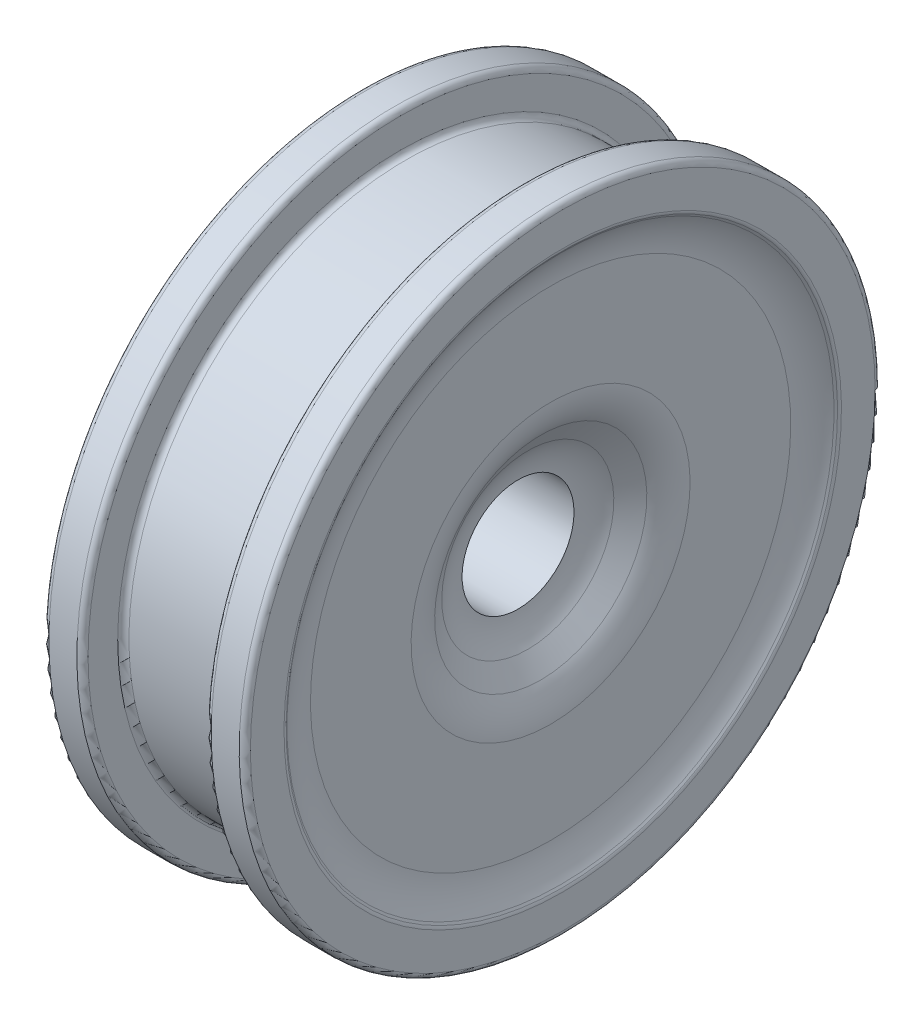
ISO-10303-21;
HEADER;
FILE_DESCRIPTION(('STEP AP214'),'2;1');
FILE_NAME('part.step','',(''),(''),'','','');
FILE_SCHEMA(('AUTOMOTIVE_DESIGN { 1 0 10303 214 1 1 1 1 }'));
ENDSEC;
DATA;
#1=APPLICATION_CONTEXT('core data for automotive mechanical design processes');
#2=APPLICATION_PROTOCOL_DEFINITION('international standard','automotive_design',2000,#1);
#3=PRODUCT_CONTEXT('',#1,'mechanical');
#4=PRODUCT('Part','Part','',(#3));
#5=PRODUCT_RELATED_PRODUCT_CATEGORY('part','',(#4));
#6=PRODUCT_DEFINITION_FORMATION('','',#4);
#7=PRODUCT_DEFINITION_CONTEXT('part definition',#1,'design');
#8=PRODUCT_DEFINITION('design','',#6,#7);
#9=PRODUCT_DEFINITION_SHAPE('','',#8);
#10=(LENGTH_UNIT() NAMED_UNIT(*) SI_UNIT(.MILLI.,.METRE.));
#11=(NAMED_UNIT(*) PLANE_ANGLE_UNIT() SI_UNIT($,.RADIAN.));
#12=(NAMED_UNIT(*) SI_UNIT($,.STERADIAN.) SOLID_ANGLE_UNIT());
#13=UNCERTAINTY_MEASURE_WITH_UNIT(LENGTH_MEASURE(1.E-05),#10,'distance_accuracy_value','');
#14=(GEOMETRIC_REPRESENTATION_CONTEXT(3) GLOBAL_UNCERTAINTY_ASSIGNED_CONTEXT((#13)) GLOBAL_UNIT_ASSIGNED_CONTEXT((#10,
#11,#12)) REPRESENTATION_CONTEXT('',''));
#15=CARTESIAN_POINT('',(0.,0.,0.));
#16=DIRECTION('',(0.,0.,1.));
#17=DIRECTION('',(1.,0.,0.));
#18=AXIS2_PLACEMENT_3D('',#15,#16,#17);
#19=CARTESIAN_POINT('',(-89.2006408216254,0.,0.));
#20=DIRECTION('',(-1.,0.,0.));
#21=DIRECTION('',(0.,-1.,0.));
#22=AXIS2_PLACEMENT_3D('',#19,#20,#21);
#23=CONICAL_SURFACE('',#22,246.261837937398,0.997519475564187);
#24=CARTESIAN_POINT('',(-87.9451923455624,0.,0.));
#25=DIRECTION('',(-1.,0.,0.));
#26=DIRECTION('',(0.,-1.,0.));
#27=AXIS2_PLACEMENT_3D('',#24,#25,#26);
#28=CIRCLE('',#27,244.317219402119);
#29=CARTESIAN_POINT('',(-87.9451923455624,-244.317219402119,0.));
#30=VERTEX_POINT('',#29);
#31=EDGE_CURVE('E10',#30,#30,#28,.T.);
#32=ORIENTED_EDGE('',*,*,#31,.F.);
#33=EDGE_LOOP('',(#32));
#34=FACE_BOUND('',#33,.T.);
#35=CARTESIAN_POINT('',(-89.2006408216254,0.,0.));
#36=DIRECTION('',(-1.,0.,0.));
#37=DIRECTION('',(0.,-1.,0.));
#38=AXIS2_PLACEMENT_3D('',#35,#36,#37);
#39=CIRCLE('',#38,246.261837937398);
#40=CARTESIAN_POINT('',(-89.2006408216254,-246.261837937398,0.));
#41=VERTEX_POINT('',#40);
#42=EDGE_CURVE('E115',#41,#41,#39,.T.);
#43=ORIENTED_EDGE('',*,*,#42,.T.);
#44=EDGE_LOOP('',(#43));
#45=FACE_BOUND('',#44,.T.);
#46=ADVANCED_FACE('F33',(#34,#45),#23,.F.);
#47=CARTESIAN_POINT('',(-134.152241383442,0.,0.));
#48=DIRECTION('',(-1.,0.,0.));
#49=DIRECTION('',(0.,-1.,0.));
#50=AXIS2_PLACEMENT_3D('',#47,#48,#49);
#51=TOROIDAL_SURFACE('',#50,214.485883206585,55.);
#52=CARTESIAN_POINT('',(-79.1522413834424,0.,0.));
#53=DIRECTION('',(-1.,0.,0.));
#54=DIRECTION('',(0.,-1.,0.));
#55=AXIS2_PLACEMENT_3D('',#52,#53,#54);
#56=CIRCLE('',#55,214.485883206585);
#57=CARTESIAN_POINT('',(-79.1522413834424,-214.485883206585,0.));
#58=VERTEX_POINT('',#57);
#59=EDGE_CURVE('E40',#58,#58,#56,.T.);
#60=ORIENTED_EDGE('',*,*,#59,.F.);
#61=EDGE_LOOP('',(#60));
#62=FACE_BOUND('',#61,.T.);
#63=ORIENTED_EDGE('',*,*,#31,.T.);
#64=EDGE_LOOP('',(#63));
#65=FACE_BOUND('',#64,.T.);
#66=ADVANCED_FACE('F154',(#62,#65),#51,.F.);
#67=CARTESIAN_POINT('',(-79.1522413834424,0.,0.));
#68=DIRECTION('',(1.,0.,0.));
#69=DIRECTION('',(0.,1.,0.));
#70=AXIS2_PLACEMENT_3D('',#67,#68,#69);
#71=PLANE('',#70);
#72=CARTESIAN_POINT('',(-79.1522413834424,0.,0.));
#73=DIRECTION('',(-1.,0.,0.));
#74=DIRECTION('',(0.,-1.,0.));
#75=AXIS2_PLACEMENT_3D('',#72,#73,#74);
#76=CIRCLE('',#75,124.592908011415);
#77=CARTESIAN_POINT('',(-79.1522413834424,-124.592908011415,0.));
#78=VERTEX_POINT('',#77);
#79=EDGE_CURVE('E44',#78,#78,#76,.T.);
#80=ORIENTED_EDGE('',*,*,#79,.F.);
#81=EDGE_LOOP('',(#80));
#82=FACE_BOUND('',#81,.T.);
#83=ORIENTED_EDGE('',*,*,#59,.T.);
#84=EDGE_LOOP('',(#83));
#85=FACE_BOUND('',#84,.T.);
#86=ADVANCED_FACE('F159',(#82,#85),#71,.F.);
#87=CARTESIAN_POINT('',(-24.1522413834424,0.,0.));
#88=DIRECTION('',(-1.,0.,0.));
#89=DIRECTION('',(0.,-1.,0.));
#90=AXIS2_PLACEMENT_3D('',#87,#88,#89);
#91=TOROIDAL_SURFACE('',#90,124.592908011415,55.);
#92=ORIENTED_EDGE('',*,*,#79,.T.);
#93=EDGE_LOOP('',(#92));
#94=FACE_BOUND('',#93,.T.);
#95=CARTESIAN_POINT('',(-70.3592904213226,0.,0.));
#96=DIRECTION('',(-1.,0.,0.));
#97=DIRECTION('',(0.,-1.,0.));
#98=AXIS2_PLACEMENT_3D('',#95,#96,#97);
#99=CIRCLE('',#98,94.7615718158815);
#100=CARTESIAN_POINT('',(-70.3592904213226,-94.7615718158815,0.));
#101=VERTEX_POINT('',#100);
#102=EDGE_CURVE('E49',#101,#101,#99,.T.);
#103=ORIENTED_EDGE('',*,*,#102,.F.);
#104=EDGE_LOOP('',(#103));
#105=FACE_BOUND('',#104,.T.);
#106=ADVANCED_FACE('F392',(#94,#105),#91,.T.);
#107=CARTESIAN_POINT('',(-70.3592904213226,0.,0.));
#108=DIRECTION('',(-1.,0.,0.));
#109=DIRECTION('',(0.,-1.,0.));
#110=AXIS2_PLACEMENT_3D('',#107,#108,#109);
#111=CONICAL_SURFACE('',#110,94.7615718158815,0.997519475564188);
#112=CARTESIAN_POINT('',(-58.7929509621198,0.,0.));
#113=DIRECTION('',(-1.,0.,0.));
#114=DIRECTION('',(0.,-1.,0.));
#115=AXIS2_PLACEMENT_3D('',#112,#113,#114);
#116=CIRCLE('',#115,76.8459675306072);
#117=CARTESIAN_POINT('',(-58.7929509621198,-76.8459675306072,0.));
#118=VERTEX_POINT('',#117);
#119=EDGE_CURVE('E52',#118,#118,#116,.T.);
#120=ORIENTED_EDGE('',*,*,#119,.F.);
#121=EDGE_LOOP('',(#120));
#122=FACE_BOUND('',#121,.T.);
#123=ORIENTED_EDGE('',*,*,#102,.T.);
#124=EDGE_LOOP('',(#123));
#125=FACE_BOUND('',#124,.T.);
#126=ADVANCED_FACE('F331',(#122,#125),#111,.F.);
#127=CARTESIAN_POINT('',(-105.,0.,0.));
#128=DIRECTION('',(-1.,0.,0.));
#129=DIRECTION('',(0.,-1.,0.));
#130=AXIS2_PLACEMENT_3D('',#127,#128,#129);
#131=DEGENERATE_TOROIDAL_SURFACE('',#130,47.0146313350741,55.,.T.);
#132=CARTESIAN_POINT('',(-50.0810818211568,0.,0.));
#133=DIRECTION('',(-1.,0.,0.));
#134=DIRECTION('',(0.,-1.,0.));
#135=AXIS2_PLACEMENT_3D('',#132,#133,#134);
#136=CIRCLE('',#135,50.);
#137=CARTESIAN_POINT('',(-50.0810818211568,0.,-50.));
#138=VERTEX_POINT('',#137);
#139=EDGE_CURVE('E118',#138,#138,#136,.F.);
#140=ORIENTED_EDGE('',*,*,#139,.T.);
#141=EDGE_LOOP('',(#140));
#142=FACE_BOUND('',#141,.T.);
#143=ORIENTED_EDGE('',*,*,#119,.T.);
#144=EDGE_LOOP('',(#143));
#145=FACE_BOUND('',#144,.T.);
#146=ADVANCED_FACE('F132',(#142,#145),#131,.F.);
#147=CARTESIAN_POINT('',(105.,0.,0.));
#148=DIRECTION('',(-1.,0.,0.));
#149=DIRECTION('',(0.,-1.,0.));
#150=AXIS2_PLACEMENT_3D('',#147,#148,#149);
#151=DEGENERATE_TOROIDAL_SURFACE('',#150,47.0146313350741,55.,.T.);
#152=CARTESIAN_POINT('',(50.0810818211568,0.,0.));
#153=DIRECTION('',(1.,0.,0.));
#154=DIRECTION('',(0.,1.,0.));
#155=AXIS2_PLACEMENT_3D('',#152,#153,#154);
#156=CIRCLE('',#155,50.);
#157=CARTESIAN_POINT('',(50.0810818211568,0.,-50.));
#158=VERTEX_POINT('',#157);
#159=EDGE_CURVE('E36',#158,#158,#156,.T.);
#160=ORIENTED_EDGE('',*,*,#159,.F.);
#161=EDGE_LOOP('',(#160));
#162=FACE_BOUND('',#161,.T.);
#163=CARTESIAN_POINT('',(58.7929509621198,0.,0.));
#164=DIRECTION('',(-1.,0.,0.));
#165=DIRECTION('',(0.,-1.,0.));
#166=AXIS2_PLACEMENT_3D('',#163,#164,#165);
#167=CIRCLE('',#166,76.8459675306072);
#168=CARTESIAN_POINT('',(58.7929509621198,-76.8459675306072,0.));
#169=VERTEX_POINT('',#168);
#170=EDGE_CURVE('E55',#169,#169,#167,.T.);
#171=ORIENTED_EDGE('',*,*,#170,.F.);
#172=EDGE_LOOP('',(#171));
#173=FACE_BOUND('',#172,.T.);
#174=ADVANCED_FACE('F128',(#162,#173),#151,.F.);
#175=CARTESIAN_POINT('',(70.3592904213226,0.,0.));
#176=DIRECTION('',(1.,0.,0.));
#177=DIRECTION('',(0.,1.,0.));
#178=AXIS2_PLACEMENT_3D('',#175,#176,#177);
#179=CONICAL_SURFACE('',#178,94.7615718158815,0.997519475564188);
#180=ORIENTED_EDGE('',*,*,#170,.T.);
#181=EDGE_LOOP('',(#180));
#182=FACE_BOUND('',#181,.T.);
#183=CARTESIAN_POINT('',(70.3592904213226,0.,0.));
#184=DIRECTION('',(-1.,0.,0.));
#185=DIRECTION('',(0.,-1.,0.));
#186=AXIS2_PLACEMENT_3D('',#183,#184,#185);
#187=CIRCLE('',#186,94.7615718158815);
#188=CARTESIAN_POINT('',(70.3592904213226,-94.7615718158815,0.));
#189=VERTEX_POINT('',#188);
#190=EDGE_CURVE('E58',#189,#189,#187,.T.);
#191=ORIENTED_EDGE('',*,*,#190,.F.);
#192=EDGE_LOOP('',(#191));
#193=FACE_BOUND('',#192,.T.);
#194=ADVANCED_FACE('F131',(#182,#193),#179,.F.);
#195=CARTESIAN_POINT('',(24.1522413834424,0.,0.));
#196=DIRECTION('',(-1.,0.,0.));
#197=DIRECTION('',(0.,-1.,0.));
#198=AXIS2_PLACEMENT_3D('',#195,#196,#197);
#199=TOROIDAL_SURFACE('',#198,124.592908011415,55.);
#200=CARTESIAN_POINT('',(79.1522413834424,0.,0.));
#201=DIRECTION('',(-1.,0.,0.));
#202=DIRECTION('',(0.,-1.,0.));
#203=AXIS2_PLACEMENT_3D('',#200,#201,#202);
#204=CIRCLE('',#203,124.592908011415);
#205=CARTESIAN_POINT('',(79.1522413834424,-124.592908011415,0.));
#206=VERTEX_POINT('',#205);
#207=EDGE_CURVE('E61',#206,#206,#204,.T.);
#208=ORIENTED_EDGE('',*,*,#207,.F.);
#209=EDGE_LOOP('',(#208));
#210=FACE_BOUND('',#209,.T.);
#211=ORIENTED_EDGE('',*,*,#190,.T.);
#212=EDGE_LOOP('',(#211));
#213=FACE_BOUND('',#212,.T.);
#214=ADVANCED_FACE('F138',(#210,#213),#199,.T.);
#215=CARTESIAN_POINT('',(79.1522413834424,0.,0.));
#216=DIRECTION('',(1.,0.,0.));
#217=DIRECTION('',(0.,1.,0.));
#218=AXIS2_PLACEMENT_3D('',#215,#216,#217);
#219=PLANE('',#218);
#220=ORIENTED_EDGE('',*,*,#207,.T.);
#221=EDGE_LOOP('',(#220));
#222=FACE_BOUND('',#221,.T.);
#223=CARTESIAN_POINT('',(79.1522413834424,0.,0.));
#224=DIRECTION('',(-1.,0.,0.));
#225=DIRECTION('',(0.,-1.,0.));
#226=AXIS2_PLACEMENT_3D('',#223,#224,#225);
#227=CIRCLE('',#226,214.485883206585);
#228=CARTESIAN_POINT('',(79.1522413834424,-214.485883206585,0.));
#229=VERTEX_POINT('',#228);
#230=EDGE_CURVE('E64',#229,#229,#227,.T.);
#231=ORIENTED_EDGE('',*,*,#230,.F.);
#232=EDGE_LOOP('',(#231));
#233=FACE_BOUND('',#232,.T.);
#234=ADVANCED_FACE('F143',(#222,#233),#219,.T.);
#235=CARTESIAN_POINT('',(134.152241383442,0.,0.));
#236=DIRECTION('',(-1.,0.,0.));
#237=DIRECTION('',(0.,-1.,0.));
#238=AXIS2_PLACEMENT_3D('',#235,#236,#237);
#239=TOROIDAL_SURFACE('',#238,214.485883206585,55.);
#240=ORIENTED_EDGE('',*,*,#230,.T.);
#241=EDGE_LOOP('',(#240));
#242=FACE_BOUND('',#241,.T.);
#243=CARTESIAN_POINT('',(87.9451923455624,0.,0.));
#244=DIRECTION('',(-1.,0.,0.));
#245=DIRECTION('',(0.,-1.,0.));
#246=AXIS2_PLACEMENT_3D('',#243,#244,#245);
#247=CIRCLE('',#246,244.317219402119);
#248=CARTESIAN_POINT('',(87.9451923455624,-244.317219402119,0.));
#249=VERTEX_POINT('',#248);
#250=EDGE_CURVE('E67',#249,#249,#247,.T.);
#251=ORIENTED_EDGE('',*,*,#250,.F.);
#252=EDGE_LOOP('',(#251));
#253=FACE_BOUND('',#252,.T.);
#254=ADVANCED_FACE('F149',(#242,#253),#239,.F.);
#255=CARTESIAN_POINT('',(89.2006408216255,0.,0.));
#256=DIRECTION('',(1.,0.,0.));
#257=DIRECTION('',(0.,1.,0.));
#258=AXIS2_PLACEMENT_3D('',#255,#256,#257);
#259=CONICAL_SURFACE('',#258,246.261837937398,0.997519475564187);
#260=ORIENTED_EDGE('',*,*,#250,.T.);
#261=EDGE_LOOP('',(#260));
#262=FACE_BOUND('',#261,.T.);
#263=CARTESIAN_POINT('',(89.2006408216255,0.,0.));
#264=DIRECTION('',(-1.,0.,0.));
#265=DIRECTION('',(0.,-1.,0.));
#266=AXIS2_PLACEMENT_3D('',#263,#264,#265);
#267=CIRCLE('',#266,246.261837937398);
#268=CARTESIAN_POINT('',(89.2006408216255,-246.261837937398,0.));
#269=VERTEX_POINT('',#268);
#270=EDGE_CURVE('E70',#269,#269,#267,.T.);
#271=ORIENTED_EDGE('',*,*,#270,.F.);
#272=EDGE_LOOP('',(#271));
#273=FACE_BOUND('',#272,.T.);
#274=ADVANCED_FACE('F230',(#262,#273),#259,.F.);
#275=CARTESIAN_POINT('',(85.,0.,0.));
#276=DIRECTION('',(-1.,0.,0.));
#277=DIRECTION('',(0.,-1.,0.));
#278=AXIS2_PLACEMENT_3D('',#275,#276,#277);
#279=TOROIDAL_SURFACE('',#278,248.973777591538,5.);
#280=ORIENTED_EDGE('',*,*,#270,.T.);
#281=EDGE_LOOP('',(#280));
#282=FACE_BOUND('',#281,.T.);
#283=CARTESIAN_POINT('',(90.,0.,0.));
#284=DIRECTION('',(-1.,0.,0.));
#285=DIRECTION('',(0.,-1.,0.));
#286=AXIS2_PLACEMENT_3D('',#283,#284,#285);
#287=CIRCLE('',#286,248.973777591538);
#288=CARTESIAN_POINT('',(90.,-248.973777591538,0.));
#289=VERTEX_POINT('',#288);
#290=EDGE_CURVE('E73',#289,#289,#287,.T.);
#291=ORIENTED_EDGE('',*,*,#290,.F.);
#292=EDGE_LOOP('',(#291));
#293=FACE_BOUND('',#292,.T.);
#294=ADVANCED_FACE('F226',(#282,#293),#279,.T.);
#295=CARTESIAN_POINT('',(90.,0.,0.));
#296=DIRECTION('',(1.,0.,0.));
#297=DIRECTION('',(0.,1.,0.));
#298=AXIS2_PLACEMENT_3D('',#295,#296,#297);
#299=PLANE('',#298);
#300=ORIENTED_EDGE('',*,*,#290,.T.);
#301=EDGE_LOOP('',(#300));
#302=FACE_BOUND('',#301,.T.);
#303=CARTESIAN_POINT('',(90.,0.,0.));
#304=DIRECTION('',(-1.,0.,0.));
#305=DIRECTION('',(0.,-1.,0.));
#306=AXIS2_PLACEMENT_3D('',#303,#304,#305);
#307=CIRCLE('',#306,279.);
#308=CARTESIAN_POINT('',(90.,-279.,0.));
#309=VERTEX_POINT('',#308);
#310=EDGE_CURVE('E76',#309,#309,#307,.T.);
#311=ORIENTED_EDGE('',*,*,#310,.F.);
#312=EDGE_LOOP('',(#311));
#313=FACE_BOUND('',#312,.T.);
#314=ADVANCED_FACE('F222',(#302,#313),#299,.T.);
#315=CARTESIAN_POINT('',(85.,0.,0.));
#316=DIRECTION('',(-1.,0.,0.));
#317=DIRECTION('',(0.,-1.,0.));
#318=AXIS2_PLACEMENT_3D('',#315,#316,#317);
#319=TOROIDAL_SURFACE('',#318,279.,5.);
#320=CARTESIAN_POINT('',(85.,0.,0.));
#321=DIRECTION('',(-1.,0.,0.));
#322=DIRECTION('',(0.,-1.,0.));
#323=AXIS2_PLACEMENT_3D('',#320,#321,#322);
#324=CIRCLE('',#323,284.);
#325=CARTESIAN_POINT('',(85.,-284.,0.));
#326=VERTEX_POINT('',#325);
#327=EDGE_CURVE('E79',#326,#326,#324,.T.);
#328=ORIENTED_EDGE('',*,*,#327,.F.);
#329=EDGE_LOOP('',(#328));
#330=FACE_BOUND('',#329,.T.);
#331=ORIENTED_EDGE('',*,*,#310,.T.);
#332=EDGE_LOOP('',(#331));
#333=FACE_BOUND('',#332,.T.);
#334=ADVANCED_FACE('F218',(#330,#333),#319,.T.);
#335=CARTESIAN_POINT('',(-50.,0.,0.));
#336=DIRECTION('',(-1.,0.,0.));
#337=DIRECTION('',(0.,-1.,0.));
#338=AXIS2_PLACEMENT_3D('',#335,#336,#337);
#339=CYLINDRICAL_SURFACE('',#338,284.);
#340=CARTESIAN_POINT('',(60.,0.,0.));
#341=DIRECTION('',(-1.,0.,0.));
#342=DIRECTION('',(0.,-1.,0.));
#343=AXIS2_PLACEMENT_3D('',#340,#341,#342);
#344=CIRCLE('',#343,284.);
#345=CARTESIAN_POINT('',(60.,-284.,0.));
#346=VERTEX_POINT('',#345);
#347=EDGE_CURVE('E82',#346,#346,#344,.T.);
#348=ORIENTED_EDGE('',*,*,#347,.F.);
#349=EDGE_LOOP('',(#348));
#350=FACE_BOUND('',#349,.T.);
#351=ORIENTED_EDGE('',*,*,#327,.T.);
#352=EDGE_LOOP('',(#351));
#353=FACE_BOUND('',#352,.T.);
#354=ADVANCED_FACE('F214',(#350,#353),#339,.T.);
#355=CARTESIAN_POINT('',(60.,0.,0.));
#356=DIRECTION('',(-1.,0.,0.));
#357=DIRECTION('',(0.,-1.,0.));
#358=AXIS2_PLACEMENT_3D('',#355,#356,#357);
#359=TOROIDAL_SURFACE('',#358,279.,5.);
#360=ORIENTED_EDGE('',*,*,#347,.T.);
#361=EDGE_LOOP('',(#360));
#362=FACE_BOUND('',#361,.T.);
#363=CARTESIAN_POINT('',(55.,0.,0.));
#364=DIRECTION('',(-1.,0.,0.));
#365=DIRECTION('',(0.,-1.,0.));
#366=AXIS2_PLACEMENT_3D('',#363,#364,#365);
#367=CIRCLE('',#366,279.);
#368=CARTESIAN_POINT('',(55.,-279.,0.));
#369=VERTEX_POINT('',#368);
#370=EDGE_CURVE('E85',#369,#369,#367,.T.);
#371=ORIENTED_EDGE('',*,*,#370,.F.);
#372=EDGE_LOOP('',(#371));
#373=FACE_BOUND('',#372,.T.);
#374=ADVANCED_FACE('F210',(#362,#373),#359,.T.);
#375=CARTESIAN_POINT('',(55.,0.,0.));
#376=DIRECTION('',(-1.,0.,0.));
#377=DIRECTION('',(0.,-1.,0.));
#378=AXIS2_PLACEMENT_3D('',#375,#376,#377);
#379=PLANE('',#378);
#380=ORIENTED_EDGE('',*,*,#370,.T.);
#381=EDGE_LOOP('',(#380));
#382=FACE_BOUND('',#381,.T.);
#383=CARTESIAN_POINT('',(55.,0.,0.));
#384=DIRECTION('',(-1.,0.,0.));
#385=DIRECTION('',(0.,-1.,0.));
#386=AXIS2_PLACEMENT_3D('',#383,#384,#385);
#387=CIRCLE('',#386,252.5);
#388=CARTESIAN_POINT('',(55.,-252.5,0.));
#389=VERTEX_POINT('',#388);
#390=EDGE_CURVE('E88',#389,#389,#387,.T.);
#391=ORIENTED_EDGE('',*,*,#390,.F.);
#392=EDGE_LOOP('',(#391));
#393=FACE_BOUND('',#392,.T.);
#394=ADVANCED_FACE('F206',(#382,#393),#379,.T.);
#395=CARTESIAN_POINT('',(50.,0.,0.));
#396=DIRECTION('',(-1.,0.,0.));
#397=DIRECTION('',(0.,-1.,0.));
#398=AXIS2_PLACEMENT_3D('',#395,#396,#397);
#399=TOROIDAL_SURFACE('',#398,252.5,5.);
#400=ORIENTED_EDGE('',*,*,#390,.T.);
#401=EDGE_LOOP('',(#400));
#402=FACE_BOUND('',#401,.T.);
#403=CARTESIAN_POINT('',(50.,0.,0.));
#404=DIRECTION('',(-1.,0.,0.));
#405=DIRECTION('',(0.,-1.,0.));
#406=AXIS2_PLACEMENT_3D('',#403,#404,#405);
#407=CIRCLE('',#406,247.5);
#408=CARTESIAN_POINT('',(50.,-247.5,0.));
#409=VERTEX_POINT('',#408);
#410=EDGE_CURVE('E91',#409,#409,#407,.T.);
#411=ORIENTED_EDGE('',*,*,#410,.F.);
#412=EDGE_LOOP('',(#411));
#413=FACE_BOUND('',#412,.T.);
#414=ADVANCED_FACE('F202',(#402,#413),#399,.F.);
#415=CARTESIAN_POINT('',(-50.,0.,0.));
#416=DIRECTION('',(-1.,0.,0.));
#417=DIRECTION('',(0.,-1.,0.));
#418=AXIS2_PLACEMENT_3D('',#415,#416,#417);
#419=CYLINDRICAL_SURFACE('',#418,247.5);
#420=ORIENTED_EDGE('',*,*,#410,.T.);
#421=EDGE_LOOP('',(#420));
#422=FACE_BOUND('',#421,.T.);
#423=CARTESIAN_POINT('',(-50.,0.,0.));
#424=DIRECTION('',(-1.,0.,0.));
#425=DIRECTION('',(0.,-1.,0.));
#426=AXIS2_PLACEMENT_3D('',#423,#424,#425);
#427=CIRCLE('',#426,247.5);
#428=CARTESIAN_POINT('',(-50.,-247.5,0.));
#429=VERTEX_POINT('',#428);
#430=EDGE_CURVE('E94',#429,#429,#427,.T.);
#431=ORIENTED_EDGE('',*,*,#430,.F.);
#432=EDGE_LOOP('',(#431));
#433=FACE_BOUND('',#432,.T.);
#434=ADVANCED_FACE('F198',(#422,#433),#419,.T.);
#435=CARTESIAN_POINT('',(-50.,0.,0.));
#436=DIRECTION('',(-1.,0.,0.));
#437=DIRECTION('',(0.,-1.,0.));
#438=AXIS2_PLACEMENT_3D('',#435,#436,#437);
#439=TOROIDAL_SURFACE('',#438,252.5,5.);
#440=CARTESIAN_POINT('',(-55.,0.,0.));
#441=DIRECTION('',(-1.,0.,0.));
#442=DIRECTION('',(0.,-1.,0.));
#443=AXIS2_PLACEMENT_3D('',#440,#441,#442);
#444=CIRCLE('',#443,252.5);
#445=CARTESIAN_POINT('',(-55.,-252.5,0.));
#446=VERTEX_POINT('',#445);
#447=EDGE_CURVE('E97',#446,#446,#444,.T.);
#448=ORIENTED_EDGE('',*,*,#447,.F.);
#449=EDGE_LOOP('',(#448));
#450=FACE_BOUND('',#449,.T.);
#451=ORIENTED_EDGE('',*,*,#430,.T.);
#452=EDGE_LOOP('',(#451));
#453=FACE_BOUND('',#452,.T.);
#454=ADVANCED_FACE('F194',(#450,#453),#439,.F.);
#455=CARTESIAN_POINT('',(-55.,0.,0.));
#456=DIRECTION('',(-1.,0.,0.));
#457=DIRECTION('',(0.,-1.,0.));
#458=AXIS2_PLACEMENT_3D('',#455,#456,#457);
#459=PLANE('',#458);
#460=CARTESIAN_POINT('',(-55.,0.,0.));
#461=DIRECTION('',(-1.,0.,0.));
#462=DIRECTION('',(0.,-1.,0.));
#463=AXIS2_PLACEMENT_3D('',#460,#461,#462);
#464=CIRCLE('',#463,279.);
#465=CARTESIAN_POINT('',(-55.,-279.,0.));
#466=VERTEX_POINT('',#465);
#467=EDGE_CURVE('E100',#466,#466,#464,.T.);
#468=ORIENTED_EDGE('',*,*,#467,.F.);
#469=EDGE_LOOP('',(#468));
#470=FACE_BOUND('',#469,.T.);
#471=ORIENTED_EDGE('',*,*,#447,.T.);
#472=EDGE_LOOP('',(#471));
#473=FACE_BOUND('',#472,.T.);
#474=ADVANCED_FACE('F190',(#470,#473),#459,.F.);
#475=CARTESIAN_POINT('',(-60.,0.,0.));
#476=DIRECTION('',(-1.,0.,0.));
#477=DIRECTION('',(0.,-1.,0.));
#478=AXIS2_PLACEMENT_3D('',#475,#476,#477);
#479=TOROIDAL_SURFACE('',#478,279.,5.);
#480=CARTESIAN_POINT('',(-60.,0.,0.));
#481=DIRECTION('',(-1.,0.,0.));
#482=DIRECTION('',(0.,-1.,0.));
#483=AXIS2_PLACEMENT_3D('',#480,#481,#482);
#484=CIRCLE('',#483,284.);
#485=CARTESIAN_POINT('',(-60.,-284.,0.));
#486=VERTEX_POINT('',#485);
#487=EDGE_CURVE('E103',#486,#486,#484,.T.);
#488=ORIENTED_EDGE('',*,*,#487,.F.);
#489=EDGE_LOOP('',(#488));
#490=FACE_BOUND('',#489,.T.);
#491=ORIENTED_EDGE('',*,*,#467,.T.);
#492=EDGE_LOOP('',(#491));
#493=FACE_BOUND('',#492,.T.);
#494=ADVANCED_FACE('F184',(#490,#493),#479,.T.);
#495=CARTESIAN_POINT('',(-50.,0.,0.));
#496=DIRECTION('',(-1.,0.,0.));
#497=DIRECTION('',(0.,-1.,0.));
#498=AXIS2_PLACEMENT_3D('',#495,#496,#497);
#499=CYLINDRICAL_SURFACE('',#498,284.);
#500=ORIENTED_EDGE('',*,*,#487,.T.);
#501=EDGE_LOOP('',(#500));
#502=FACE_BOUND('',#501,.T.);
#503=CARTESIAN_POINT('',(-85.,0.,0.));
#504=DIRECTION('',(-1.,0.,0.));
#505=DIRECTION('',(0.,-1.,0.));
#506=AXIS2_PLACEMENT_3D('',#503,#504,#505);
#507=CIRCLE('',#506,284.);
#508=CARTESIAN_POINT('',(-85.,-284.,0.));
#509=VERTEX_POINT('',#508);
#510=EDGE_CURVE('E106',#509,#509,#507,.T.);
#511=ORIENTED_EDGE('',*,*,#510,.F.);
#512=EDGE_LOOP('',(#511));
#513=FACE_BOUND('',#512,.T.);
#514=ADVANCED_FACE('F178',(#502,#513),#499,.T.);
#515=CARTESIAN_POINT('',(-85.,0.,0.));
#516=DIRECTION('',(-1.,0.,0.));
#517=DIRECTION('',(0.,-1.,0.));
#518=AXIS2_PLACEMENT_3D('',#515,#516,#517);
#519=TOROIDAL_SURFACE('',#518,279.,5.);
#520=ORIENTED_EDGE('',*,*,#510,.T.);
#521=EDGE_LOOP('',(#520));
#522=FACE_BOUND('',#521,.T.);
#523=CARTESIAN_POINT('',(-90.,0.,0.));
#524=DIRECTION('',(-1.,0.,0.));
#525=DIRECTION('',(0.,-1.,0.));
#526=AXIS2_PLACEMENT_3D('',#523,#524,#525);
#527=CIRCLE('',#526,279.);
#528=CARTESIAN_POINT('',(-90.,-279.,0.));
#529=VERTEX_POINT('',#528);
#530=EDGE_CURVE('E109',#529,#529,#527,.T.);
#531=ORIENTED_EDGE('',*,*,#530,.F.);
#532=EDGE_LOOP('',(#531));
#533=FACE_BOUND('',#532,.T.);
#534=ADVANCED_FACE('F173',(#522,#533),#519,.T.);
#535=CARTESIAN_POINT('',(-90.,0.,0.));
#536=DIRECTION('',(1.,0.,0.));
#537=DIRECTION('',(0.,1.,0.));
#538=AXIS2_PLACEMENT_3D('',#535,#536,#537);
#539=PLANE('',#538);
#540=CARTESIAN_POINT('',(-90.,0.,0.));
#541=DIRECTION('',(-1.,0.,0.));
#542=DIRECTION('',(0.,-1.,0.));
#543=AXIS2_PLACEMENT_3D('',#540,#541,#542);
#544=CIRCLE('',#543,248.973777591538);
#545=CARTESIAN_POINT('',(-90.,-248.973777591538,0.));
#546=VERTEX_POINT('',#545);
#547=EDGE_CURVE('E112',#546,#546,#544,.T.);
#548=ORIENTED_EDGE('',*,*,#547,.F.);
#549=EDGE_LOOP('',(#548));
#550=FACE_BOUND('',#549,.T.);
#551=ORIENTED_EDGE('',*,*,#530,.T.);
#552=EDGE_LOOP('',(#551));
#553=FACE_BOUND('',#552,.T.);
#554=ADVANCED_FACE('F167',(#550,#553),#539,.F.);
#555=CARTESIAN_POINT('',(-85.,0.,0.));
#556=DIRECTION('',(-1.,0.,0.));
#557=DIRECTION('',(0.,-1.,0.));
#558=AXIS2_PLACEMENT_3D('',#555,#556,#557);
#559=TOROIDAL_SURFACE('',#558,248.973777591538,5.);
#560=ORIENTED_EDGE('',*,*,#42,.F.);
#561=EDGE_LOOP('',(#560));
#562=FACE_BOUND('',#561,.T.);
#563=ORIENTED_EDGE('',*,*,#547,.T.);
#564=EDGE_LOOP('',(#563));
#565=FACE_BOUND('',#564,.T.);
#566=ADVANCED_FACE('F164',(#562,#565),#559,.T.);
#567=CARTESIAN_POINT('',(-90.,0.,0.));
#568=DIRECTION('',(1.,0.,0.));
#569=DIRECTION('',(0.,0.,-1.));
#570=AXIS2_PLACEMENT_3D('',#567,#568,#569);
#571=CYLINDRICAL_SURFACE('',#570,50.);
#572=CARTESIAN_POINT('',(50.0810818211568,0.,-50.));
#573=CARTESIAN_POINT('',(49.0377259498827,0.,-50.));
#574=CARTESIAN_POINT('',(47.9943700786086,0.,-50.));
#575=CARTESIAN_POINT('',(45.9076583360604,0.,-50.));
#576=CARTESIAN_POINT('',(44.8643024647863,0.,-50.));
#577=CARTESIAN_POINT('',(42.7775907222381,0.,-50.));
#578=CARTESIAN_POINT('',(41.734234850964,0.,-50.));
#579=CARTESIAN_POINT('',(39.6475231084158,0.,-50.));
#580=CARTESIAN_POINT('',(38.6041672371417,0.,-50.));
#581=CARTESIAN_POINT('',(36.5174554945935,0.,-50.));
#582=CARTESIAN_POINT('',(35.4740996233194,0.,-50.));
#583=CARTESIAN_POINT('',(33.3873878807712,0.,-50.));
#584=CARTESIAN_POINT('',(32.3440320094971,0.,-50.));
#585=CARTESIAN_POINT('',(30.2573202669489,0.,-50.));
#586=CARTESIAN_POINT('',(29.2139643956748,0.,-50.));
#587=CARTESIAN_POINT('',(27.1272526531266,0.,-50.));
#588=CARTESIAN_POINT('',(26.0838967818525,0.,-50.));
#589=CARTESIAN_POINT('',(23.9971850393043,0.,-50.));
#590=CARTESIAN_POINT('',(22.9538291680302,0.,-50.));
#591=CARTESIAN_POINT('',(20.867117425482,0.,-50.));
#592=CARTESIAN_POINT('',(19.8237615542079,0.,-50.));
#593=CARTESIAN_POINT('',(17.7370498116597,0.,-50.));
#594=CARTESIAN_POINT('',(16.6936939403856,0.,-50.));
#595=CARTESIAN_POINT('',(14.6069821978374,0.,-50.));
#596=CARTESIAN_POINT('',(13.5636263265633,0.,-50.));
#597=CARTESIAN_POINT('',(11.4769145840151,0.,-50.));
#598=CARTESIAN_POINT('',(10.433558712741,0.,-50.));
#599=CARTESIAN_POINT('',(8.34684697019279,0.,-50.));
#600=CARTESIAN_POINT('',(7.30349109891869,0.,-50.));
#601=CARTESIAN_POINT('',(5.21677935637048,0.,-50.));
#602=CARTESIAN_POINT('',(4.17342348509638,0.,-50.));
#603=CARTESIAN_POINT('',(2.08671174254818,0.,-50.));
#604=CARTESIAN_POINT('',(1.04335587127409,0.,-50.));
#605=CARTESIAN_POINT('',(-1.04335587127411,0.,-50.));
#606=CARTESIAN_POINT('',(-2.08671174254821,0.,-50.));
#607=CARTESIAN_POINT('',(-4.17342348509641,0.,-50.));
#608=CARTESIAN_POINT('',(-5.21677935637051,0.,-50.));
#609=CARTESIAN_POINT('',(-7.30349109891872,0.,-50.));
#610=CARTESIAN_POINT('',(-8.34684697019282,0.,-50.));
#611=CARTESIAN_POINT('',(-10.433558712741,0.,-50.));
#612=CARTESIAN_POINT('',(-11.4769145840151,0.,-50.));
#613=CARTESIAN_POINT('',(-13.5636263265633,0.,-50.));
#614=CARTESIAN_POINT('',(-14.6069821978374,0.,-50.));
#615=CARTESIAN_POINT('',(-16.6936939403856,0.,-50.));
#616=CARTESIAN_POINT('',(-17.7370498116597,0.,-50.));
#617=CARTESIAN_POINT('',(-19.8237615542079,0.,-50.));
#618=CARTESIAN_POINT('',(-20.867117425482,0.,-50.));
#619=CARTESIAN_POINT('',(-22.9538291680302,0.,-50.));
#620=CARTESIAN_POINT('',(-23.9971850393043,0.,-50.));
#621=CARTESIAN_POINT('',(-26.0838967818525,0.,-50.));
#622=CARTESIAN_POINT('',(-27.1272526531266,0.,-50.));
#623=CARTESIAN_POINT('',(-29.2139643956748,0.,-50.));
#624=CARTESIAN_POINT('',(-30.2573202669489,0.,-50.));
#625=CARTESIAN_POINT('',(-32.3440320094971,0.,-50.));
#626=CARTESIAN_POINT('',(-33.3873878807712,0.,-50.));
#627=CARTESIAN_POINT('',(-35.4740996233194,0.,-50.));
#628=CARTESIAN_POINT('',(-36.5174554945935,0.,-50.));
#629=CARTESIAN_POINT('',(-38.6041672371417,0.,-50.));
#630=CARTESIAN_POINT('',(-39.6475231084158,0.,-50.));
#631=CARTESIAN_POINT('',(-41.734234850964,0.,-50.));
#632=CARTESIAN_POINT('',(-42.7775907222381,0.,-50.));
#633=CARTESIAN_POINT('',(-44.8643024647863,0.,-50.));
#634=CARTESIAN_POINT('',(-45.9076583360604,0.,-50.));
#635=CARTESIAN_POINT('',(-47.9943700786086,0.,-50.));
#636=CARTESIAN_POINT('',(-49.0377259498827,0.,-50.));
#637=CARTESIAN_POINT('',(-50.0810818211568,0.,-50.));
#638=B_SPLINE_CURVE_WITH_KNOTS('',3,(#572,#573,#574,#575,#576,#577,#578,#579,#580,#581,#582,
#583,#584,#585,#586,#587,#588,#589,#590,#591,#592,#593,#594,#595,#596,#597,#598,#599,#600,#601,
#602,#603,#604,#605,#606,#607,#608,#609,#610,#611,#612,#613,#614,#615,#616,#617,#618,#619,#620,
#621,#622,#623,#624,#625,#626,#627,#628,#629,#630,#631,#632,#633,#634,#635,#636,#637),
.UNSPECIFIED.,.F.,.F.,(4,2,2,2,2,2,2,2,2,2,2,2,2,2,2,2,2,2,2,2,2,2,2,2,2,2,2,2,2,2,2,2,4),(0.,
3.13006761382231,6.2601352276446,9.39020284146691,12.5202704552892,15.6503380691115,
18.7804056829338,21.9104732967561,25.0405409105784,28.1706085244007,31.300676138223,
34.4307437520453,37.5608113658676,40.6908789796899,43.8209465935122,46.9510142073345,
50.0810818211568,53.2111494349791,56.3412170488014,59.4712846626237,62.601352276446,
65.7314198902683,68.8614875040906,71.9915551179129,75.1216227317352,78.2516903455575,
81.3817579593798,84.5118255732021,87.6418931870244,90.7719608008467,93.902028414669,
97.0320960284913,100.162163642314),.UNSPECIFIED.);
#639=EDGE_CURVE('BSEAM125',#158,#138,#638,.T.);
#640=ORIENTED_EDGE('',*,*,#159,.T.);
#641=ORIENTED_EDGE('',*,*,#139,.F.);
#642=ORIENTED_EDGE('',*,*,#639,.T.);
#643=ORIENTED_EDGE('',*,*,#639,.F.);
#644=EDGE_LOOP('',(#640,#642,#641,#643));
#645=FACE_BOUND('',#644,.T.);
#646=ADVANCED_FACE('F125',(#645),#571,.F.);
#647=CLOSED_SHELL('',(#46,#66,#86,#106,#126,#146,#174,#194,#214,#234,#254,#274,#294,#314,#334,
#354,#374,#394,#414,#434,#454,#474,#494,#514,#534,#554,#566,#646));
#648=MANIFOLD_SOLID_BREP('B2',#647);
#649=ADVANCED_BREP_SHAPE_REPRESENTATION('',(#18,#648),#14);
#650=SHAPE_DEFINITION_REPRESENTATION(#9,#649);
ENDSEC;
END-ISO-10303-21;
